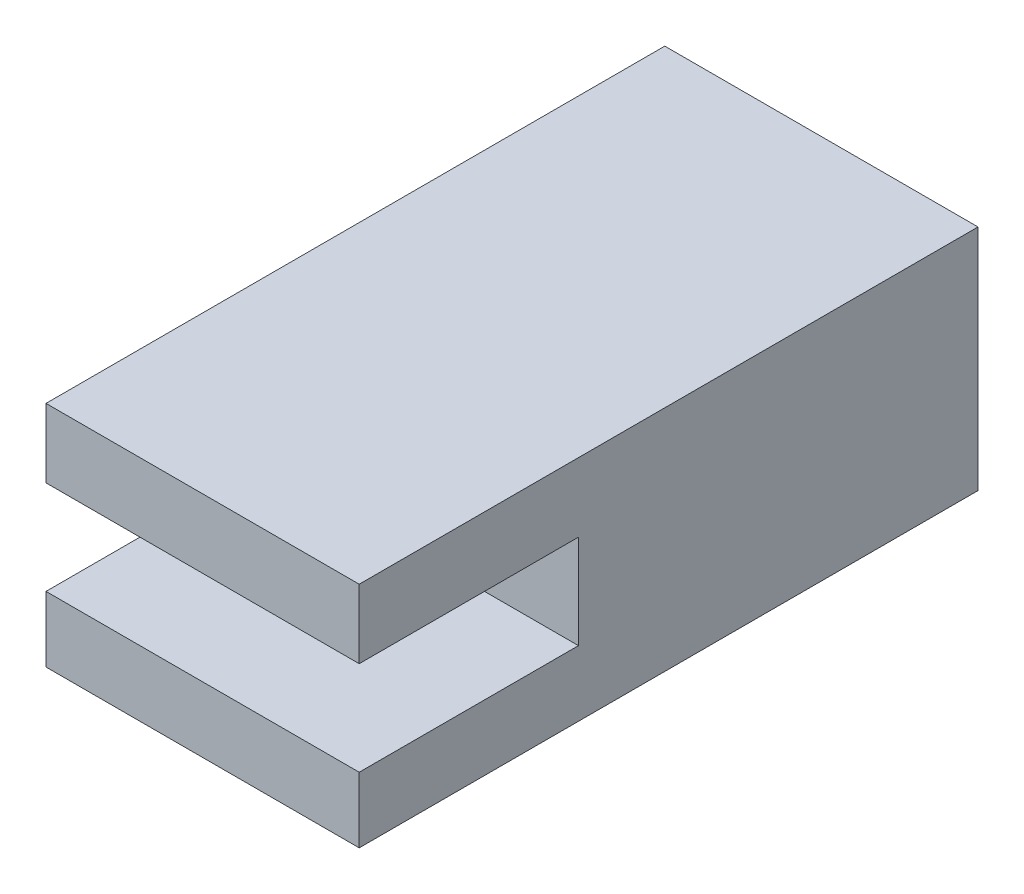
ISO-10303-21;
HEADER;
FILE_DESCRIPTION(('STEP AP214'),'2;1');
FILE_NAME('part.step','',(''),(''),'','','');
FILE_SCHEMA(('AUTOMOTIVE_DESIGN { 1 0 10303 214 1 1 1 1 }'));
ENDSEC;
DATA;
#1=APPLICATION_CONTEXT('core data for automotive mechanical design processes');
#2=APPLICATION_PROTOCOL_DEFINITION('international standard','automotive_design',2000,#1);
#3=PRODUCT_CONTEXT('',#1,'mechanical');
#4=PRODUCT('Part','Part','',(#3));
#5=PRODUCT_RELATED_PRODUCT_CATEGORY('part','',(#4));
#6=PRODUCT_DEFINITION_FORMATION('','',#4);
#7=PRODUCT_DEFINITION_CONTEXT('part definition',#1,'design');
#8=PRODUCT_DEFINITION('design','',#6,#7);
#9=PRODUCT_DEFINITION_SHAPE('','',#8);
#10=(LENGTH_UNIT() NAMED_UNIT(*) SI_UNIT(.MILLI.,.METRE.));
#11=(NAMED_UNIT(*) PLANE_ANGLE_UNIT() SI_UNIT($,.RADIAN.));
#12=(NAMED_UNIT(*) SI_UNIT($,.STERADIAN.) SOLID_ANGLE_UNIT());
#13=UNCERTAINTY_MEASURE_WITH_UNIT(LENGTH_MEASURE(1.E-05),#10,'distance_accuracy_value','');
#14=(GEOMETRIC_REPRESENTATION_CONTEXT(3) GLOBAL_UNCERTAINTY_ASSIGNED_CONTEXT((#13)) GLOBAL_UNIT_ASSIGNED_CONTEXT((#10,
#11,#12)) REPRESENTATION_CONTEXT('',''));
#15=CARTESIAN_POINT('',(0.,0.,0.));
#16=DIRECTION('',(0.,0.,1.));
#17=DIRECTION('',(1.,0.,0.));
#18=AXIS2_PLACEMENT_3D('',#15,#16,#17);
#19=CARTESIAN_POINT('',(10.,7.29078014184397,0.));
#20=DIRECTION('',(0.,-1.,0.));
#21=DIRECTION('',(0.,0.,-1.));
#22=AXIS2_PLACEMENT_3D('',#19,#20,#21);
#23=PLANE('',#22);
#24=DIRECTION('',(0.,0.,1.));
#25=VECTOR('',#24,1.);
#26=CARTESIAN_POINT('',(0.,7.29078014184397,0.));
#27=LINE('',#26,#25);
#28=CARTESIAN_POINT('',(0.,7.29078014184397,-19.7563345998256));
#29=VERTEX_POINT('',#28);
#30=CARTESIAN_POINT('',(0.,7.29078014184397,0.));
#31=VERTEX_POINT('',#30);
#32=EDGE_CURVE('E171',#29,#31,#27,.T.);
#33=ORIENTED_EDGE('',*,*,#32,.T.);
#34=DIRECTION('',(-1.,0.,0.));
#35=VECTOR('',#34,1.);
#36=CARTESIAN_POINT('',(10.,7.29078014184397,0.));
#37=LINE('',#36,#35);
#38=CARTESIAN_POINT('',(10.,7.29078014184397,0.));
#39=VERTEX_POINT('',#38);
#40=EDGE_CURVE('E81',#39,#31,#37,.T.);
#41=ORIENTED_EDGE('',*,*,#40,.F.);
#42=DIRECTION('',(0.,0.,1.));
#43=VECTOR('',#42,1.);
#44=CARTESIAN_POINT('',(10.,7.29078014184397,0.));
#45=LINE('',#44,#43);
#46=CARTESIAN_POINT('',(10.,7.29078014184397,-19.7563345998256));
#47=VERTEX_POINT('',#46);
#48=EDGE_CURVE('E185',#47,#39,#45,.T.);
#49=ORIENTED_EDGE('',*,*,#48,.F.);
#50=DIRECTION('',(-1.,0.,0.));
#51=VECTOR('',#50,1.);
#52=CARTESIAN_POINT('',(10.,7.29078014184397,-19.7563345998256));
#53=LINE('',#52,#51);
#54=EDGE_CURVE('E12',#47,#29,#53,.T.);
#55=ORIENTED_EDGE('',*,*,#54,.T.);
#56=EDGE_LOOP('',(#33,#41,#49,#55));
#57=FACE_BOUND('',#56,.T.);
#58=ADVANCED_FACE('F71',(#57),#23,.F.);
#59=CARTESIAN_POINT('',(10.,0.,0.));
#60=DIRECTION('',(0.,0.,1.));
#61=DIRECTION('',(0.,-1.,0.));
#62=AXIS2_PLACEMENT_3D('',#59,#60,#61);
#63=PLANE('',#62);
#64=DIRECTION('',(0.,1.,0.));
#65=VECTOR('',#64,1.);
#66=CARTESIAN_POINT('',(0.,0.,0.));
#67=LINE('',#66,#65);
#68=CARTESIAN_POINT('',(0.,5.09219858156028,0.));
#69=VERTEX_POINT('',#68);
#70=EDGE_CURVE('E168',#69,#31,#67,.T.);
#71=ORIENTED_EDGE('',*,*,#70,.F.);
#72=DIRECTION('',(-1.,0.,0.));
#73=VECTOR('',#72,1.);
#74=CARTESIAN_POINT('',(10.,5.09219858156028,0.));
#75=LINE('',#74,#73);
#76=CARTESIAN_POINT('',(10.,5.09219858156028,0.));
#77=VERTEX_POINT('',#76);
#78=EDGE_CURVE('E154',#77,#69,#75,.T.);
#79=ORIENTED_EDGE('',*,*,#78,.F.);
#80=DIRECTION('',(0.,1.,0.));
#81=VECTOR('',#80,1.);
#82=CARTESIAN_POINT('',(10.,0.,0.));
#83=LINE('',#82,#81);
#84=EDGE_CURVE('E182',#77,#39,#83,.T.);
#85=ORIENTED_EDGE('',*,*,#84,.T.);
#86=ORIENTED_EDGE('',*,*,#40,.T.);
#87=EDGE_LOOP('',(#71,#79,#85,#86));
#88=FACE_BOUND('',#87,.T.);
#89=ADVANCED_FACE('F214',(#88),#63,.T.);
#90=CARTESIAN_POINT('',(10.,5.09219858156028,0.));
#91=DIRECTION('',(0.,-1.,0.));
#92=DIRECTION('',(0.,0.,-1.));
#93=AXIS2_PLACEMENT_3D('',#90,#91,#92);
#94=PLANE('',#93);
#95=DIRECTION('',(0.,0.,1.));
#96=VECTOR('',#95,1.);
#97=CARTESIAN_POINT('',(0.,5.09219858156028,0.));
#98=LINE('',#97,#96);
#99=CARTESIAN_POINT('',(0.,5.09219858156028,-7.));
#100=VERTEX_POINT('',#99);
#101=EDGE_CURVE('E165',#100,#69,#98,.T.);
#102=ORIENTED_EDGE('',*,*,#101,.F.);
#103=DIRECTION('',(-1.,0.,0.));
#104=VECTOR('',#103,1.);
#105=CARTESIAN_POINT('',(10.,5.09219858156028,-7.));
#106=LINE('',#105,#104);
#107=CARTESIAN_POINT('',(10.,5.09219858156028,-7.));
#108=VERTEX_POINT('',#107);
#109=EDGE_CURVE('E156',#108,#100,#106,.T.);
#110=ORIENTED_EDGE('',*,*,#109,.F.);
#111=DIRECTION('',(0.,0.,1.));
#112=VECTOR('',#111,1.);
#113=CARTESIAN_POINT('',(10.,5.09219858156028,0.));
#114=LINE('',#113,#112);
#115=EDGE_CURVE('E179',#108,#77,#114,.T.);
#116=ORIENTED_EDGE('',*,*,#115,.T.);
#117=ORIENTED_EDGE('',*,*,#78,.T.);
#118=EDGE_LOOP('',(#102,#110,#116,#117));
#119=FACE_BOUND('',#118,.T.);
#120=ADVANCED_FACE('F207',(#119),#94,.T.);
#121=CARTESIAN_POINT('',(10.,0.,-7.));
#122=DIRECTION('',(0.,0.,1.));
#123=DIRECTION('',(1.,0.,0.));
#124=AXIS2_PLACEMENT_3D('',#121,#122,#123);
#125=PLANE('',#124);
#126=DIRECTION('',(0.,1.,0.));
#127=VECTOR('',#126,1.);
#128=CARTESIAN_POINT('',(0.,0.,-7.));
#129=LINE('',#128,#127);
#130=CARTESIAN_POINT('',(0.,2.09219858156028,-7.));
#131=VERTEX_POINT('',#130);
#132=EDGE_CURVE('E163',#131,#100,#129,.T.);
#133=ORIENTED_EDGE('',*,*,#132,.F.);
#134=DIRECTION('',(-1.,0.,0.));
#135=VECTOR('',#134,1.);
#136=CARTESIAN_POINT('',(10.,2.09219858156028,-7.));
#137=LINE('',#136,#135);
#138=CARTESIAN_POINT('',(10.,2.09219858156028,-7.));
#139=VERTEX_POINT('',#138);
#140=EDGE_CURVE('E143',#139,#131,#137,.T.);
#141=ORIENTED_EDGE('',*,*,#140,.F.);
#142=DIRECTION('',(0.,1.,0.));
#143=VECTOR('',#142,1.);
#144=CARTESIAN_POINT('',(10.,0.,-7.));
#145=LINE('',#144,#143);
#146=EDGE_CURVE('E176',#139,#108,#145,.T.);
#147=ORIENTED_EDGE('',*,*,#146,.T.);
#148=ORIENTED_EDGE('',*,*,#109,.T.);
#149=EDGE_LOOP('',(#133,#141,#147,#148));
#150=FACE_BOUND('',#149,.T.);
#151=ADVANCED_FACE('F210',(#150),#125,.T.);
#152=CARTESIAN_POINT('',(10.,0.,0.));
#153=DIRECTION('',(0.,1.,0.));
#154=DIRECTION('',(0.,0.,1.));
#155=AXIS2_PLACEMENT_3D('',#152,#153,#154);
#156=PLANE('',#155);
#157=DIRECTION('',(0.,0.,-1.));
#158=VECTOR('',#157,1.);
#159=CARTESIAN_POINT('',(0.,0.,0.));
#160=LINE('',#159,#158);
#161=CARTESIAN_POINT('',(0.,0.,0.));
#162=VERTEX_POINT('',#161);
#163=CARTESIAN_POINT('',(0.,0.,-19.7563345998256));
#164=VERTEX_POINT('',#163);
#165=EDGE_CURVE('E125',#162,#164,#160,.T.);
#166=ORIENTED_EDGE('',*,*,#165,.T.);
#167=DIRECTION('',(-1.,0.,0.));
#168=VECTOR('',#167,1.);
#169=CARTESIAN_POINT('',(10.,0.,-19.7563345998256));
#170=LINE('',#169,#168);
#171=CARTESIAN_POINT('',(10.,0.,-19.7563345998256));
#172=VERTEX_POINT('',#171);
#173=EDGE_CURVE('E159',#172,#164,#170,.T.);
#174=ORIENTED_EDGE('',*,*,#173,.F.);
#175=DIRECTION('',(0.,0.,-1.));
#176=VECTOR('',#175,1.);
#177=CARTESIAN_POINT('',(10.,0.,0.));
#178=LINE('',#177,#176);
#179=CARTESIAN_POINT('',(10.,0.,0.));
#180=VERTEX_POINT('',#179);
#181=EDGE_CURVE('E90',#180,#172,#178,.T.);
#182=ORIENTED_EDGE('',*,*,#181,.F.);
#183=DIRECTION('',(-1.,0.,0.));
#184=VECTOR('',#183,1.);
#185=CARTESIAN_POINT('',(10.,0.,0.));
#186=LINE('',#185,#184);
#187=EDGE_CURVE('E75',#180,#162,#186,.T.);
#188=ORIENTED_EDGE('',*,*,#187,.T.);
#189=EDGE_LOOP('',(#166,#174,#182,#188));
#190=FACE_BOUND('',#189,.T.);
#191=ADVANCED_FACE('F225',(#190),#156,.F.);
#192=CARTESIAN_POINT('',(10.,0.,-19.7563345998256));
#193=DIRECTION('',(0.,0.,-1.));
#194=DIRECTION('',(-1.,0.,0.));
#195=AXIS2_PLACEMENT_3D('',#192,#193,#194);
#196=PLANE('',#195);
#197=DIRECTION('',(0.,-1.,0.));
#198=VECTOR('',#197,1.);
#199=CARTESIAN_POINT('',(0.,0.,-19.7563345998256));
#200=LINE('',#199,#198);
#201=EDGE_CURVE('E140',#29,#164,#200,.T.);
#202=ORIENTED_EDGE('',*,*,#201,.F.);
#203=ORIENTED_EDGE('',*,*,#54,.F.);
#204=DIRECTION('',(0.,-1.,0.));
#205=VECTOR('',#204,1.);
#206=CARTESIAN_POINT('',(10.,0.,-19.7563345998256));
#207=LINE('',#206,#205);
#208=EDGE_CURVE('E162',#47,#172,#207,.T.);
#209=ORIENTED_EDGE('',*,*,#208,.T.);
#210=ORIENTED_EDGE('',*,*,#173,.T.);
#211=EDGE_LOOP('',(#202,#203,#209,#210));
#212=FACE_BOUND('',#211,.T.);
#213=ADVANCED_FACE('F192',(#212),#196,.T.);
#214=CARTESIAN_POINT('',(0.,0.,0.));
#215=DIRECTION('',(1.,0.,0.));
#216=DIRECTION('',(0.,0.,-1.));
#217=AXIS2_PLACEMENT_3D('',#214,#215,#216);
#218=PLANE('',#217);
#219=ORIENTED_EDGE('',*,*,#201,.T.);
#220=ORIENTED_EDGE('',*,*,#165,.F.);
#221=DIRECTION('',(0.,1.,0.));
#222=VECTOR('',#221,1.);
#223=CARTESIAN_POINT('',(0.,0.,0.));
#224=LINE('',#223,#222);
#225=CARTESIAN_POINT('',(0.,2.09219858156028,0.));
#226=VERTEX_POINT('',#225);
#227=EDGE_CURVE('E135',#162,#226,#224,.T.);
#228=ORIENTED_EDGE('',*,*,#227,.T.);
#229=DIRECTION('',(0.,0.,-1.));
#230=VECTOR('',#229,1.);
#231=CARTESIAN_POINT('',(0.,2.09219858156028,0.));
#232=LINE('',#231,#230);
#233=EDGE_CURVE('E142',#226,#131,#232,.T.);
#234=ORIENTED_EDGE('',*,*,#233,.T.);
#235=ORIENTED_EDGE('',*,*,#132,.T.);
#236=ORIENTED_EDGE('',*,*,#101,.T.);
#237=ORIENTED_EDGE('',*,*,#70,.T.);
#238=ORIENTED_EDGE('',*,*,#32,.F.);
#239=EDGE_LOOP('',(#219,#220,#228,#234,#235,#236,#237,#238));
#240=FACE_BOUND('',#239,.T.);
#241=ADVANCED_FACE('F147',(#240),#218,.F.);
#242=CARTESIAN_POINT('',(10.,0.,0.));
#243=DIRECTION('',(1.,0.,0.));
#244=DIRECTION('',(0.,0.,-1.));
#245=AXIS2_PLACEMENT_3D('',#242,#243,#244);
#246=PLANE('',#245);
#247=ORIENTED_EDGE('',*,*,#208,.F.);
#248=ORIENTED_EDGE('',*,*,#48,.T.);
#249=ORIENTED_EDGE('',*,*,#84,.F.);
#250=ORIENTED_EDGE('',*,*,#115,.F.);
#251=ORIENTED_EDGE('',*,*,#146,.F.);
#252=DIRECTION('',(0.,0.,-1.));
#253=VECTOR('',#252,1.);
#254=CARTESIAN_POINT('',(10.,2.09219858156028,0.));
#255=LINE('',#254,#253);
#256=CARTESIAN_POINT('',(10.,2.09219858156028,0.));
#257=VERTEX_POINT('',#256);
#258=EDGE_CURVE('E148',#257,#139,#255,.T.);
#259=ORIENTED_EDGE('',*,*,#258,.F.);
#260=DIRECTION('',(0.,1.,0.));
#261=VECTOR('',#260,1.);
#262=CARTESIAN_POINT('',(10.,0.,0.));
#263=LINE('',#262,#261);
#264=EDGE_CURVE('E136',#180,#257,#263,.T.);
#265=ORIENTED_EDGE('',*,*,#264,.F.);
#266=ORIENTED_EDGE('',*,*,#181,.T.);
#267=EDGE_LOOP('',(#247,#248,#249,#250,#251,#259,#265,#266));
#268=FACE_BOUND('',#267,.T.);
#269=ADVANCED_FACE('F194',(#268),#246,.T.);
#270=CARTESIAN_POINT('',(10.,0.,0.));
#271=DIRECTION('',(0.,0.,1.));
#272=DIRECTION('',(1.,0.,0.));
#273=AXIS2_PLACEMENT_3D('',#270,#271,#272);
#274=PLANE('',#273);
#275=ORIENTED_EDGE('',*,*,#227,.F.);
#276=ORIENTED_EDGE('',*,*,#187,.F.);
#277=ORIENTED_EDGE('',*,*,#264,.T.);
#278=DIRECTION('',(-1.,0.,0.));
#279=VECTOR('',#278,1.);
#280=CARTESIAN_POINT('',(10.,2.09219858156028,0.));
#281=LINE('',#280,#279);
#282=EDGE_CURVE('E131',#257,#226,#281,.T.);
#283=ORIENTED_EDGE('',*,*,#282,.T.);
#284=EDGE_LOOP('',(#275,#276,#277,#283));
#285=FACE_BOUND('',#284,.T.);
#286=ADVANCED_FACE('F133',(#285),#274,.T.);
#287=CARTESIAN_POINT('',(10.,2.09219858156028,0.));
#288=DIRECTION('',(0.,1.,0.));
#289=DIRECTION('',(0.,0.,1.));
#290=AXIS2_PLACEMENT_3D('',#287,#288,#289);
#291=PLANE('',#290);
#292=ORIENTED_EDGE('',*,*,#258,.T.);
#293=ORIENTED_EDGE('',*,*,#140,.T.);
#294=ORIENTED_EDGE('',*,*,#233,.F.);
#295=ORIENTED_EDGE('',*,*,#282,.F.);
#296=EDGE_LOOP('',(#292,#293,#294,#295));
#297=FACE_BOUND('',#296,.T.);
#298=ADVANCED_FACE('F73',(#297),#291,.T.);
#299=CLOSED_SHELL('',(#58,#89,#120,#151,#191,#213,#241,#269,#286,#298));
#300=MANIFOLD_SOLID_BREP('B2',#299);
#301=ADVANCED_BREP_SHAPE_REPRESENTATION('',(#18,#300),#14);
#302=SHAPE_DEFINITION_REPRESENTATION(#9,#301);
ENDSEC;
END-ISO-10303-21;
